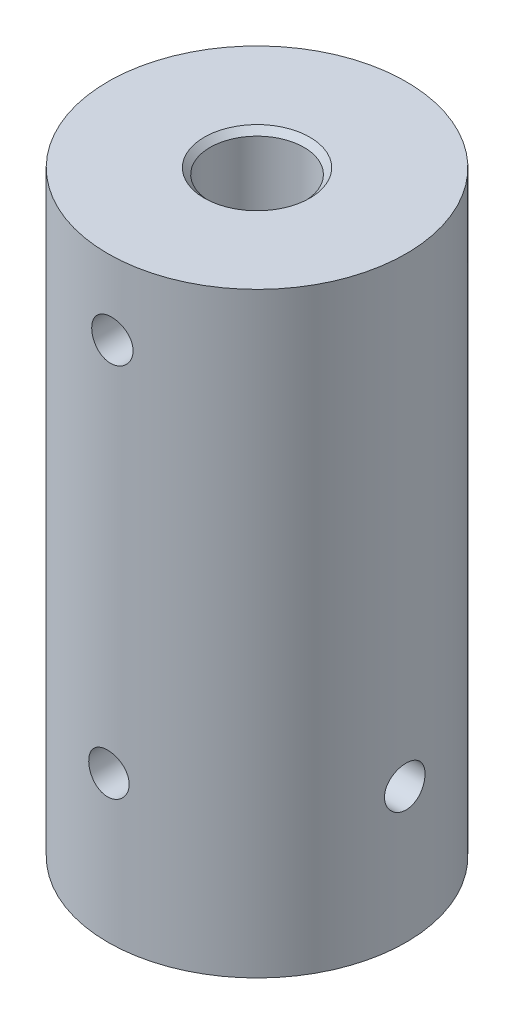
ISO-10303-21;
HEADER;
FILE_DESCRIPTION(('STEP AP214'),'2;1');
FILE_NAME('part.step','',(''),(''),'','','');
FILE_SCHEMA(('AUTOMOTIVE_DESIGN { 1 0 10303 214 1 1 1 1 }'));
ENDSEC;
DATA;
#1=APPLICATION_CONTEXT('core data for automotive mechanical design processes');
#2=APPLICATION_PROTOCOL_DEFINITION('international standard','automotive_design',2000,#1);
#3=PRODUCT_CONTEXT('',#1,'mechanical');
#4=PRODUCT('Part','Part','',(#3));
#5=PRODUCT_RELATED_PRODUCT_CATEGORY('part','',(#4));
#6=PRODUCT_DEFINITION_FORMATION('','',#4);
#7=PRODUCT_DEFINITION_CONTEXT('part definition',#1,'design');
#8=PRODUCT_DEFINITION('design','',#6,#7);
#9=PRODUCT_DEFINITION_SHAPE('','',#8);
#10=(LENGTH_UNIT() NAMED_UNIT(*) SI_UNIT(.MILLI.,.METRE.));
#11=(NAMED_UNIT(*) PLANE_ANGLE_UNIT() SI_UNIT($,.RADIAN.));
#12=(NAMED_UNIT(*) SI_UNIT($,.STERADIAN.) SOLID_ANGLE_UNIT());
#13=UNCERTAINTY_MEASURE_WITH_UNIT(LENGTH_MEASURE(1.E-05),#10,'distance_accuracy_value','');
#14=(GEOMETRIC_REPRESENTATION_CONTEXT(3) GLOBAL_UNCERTAINTY_ASSIGNED_CONTEXT((#13)) GLOBAL_UNIT_ASSIGNED_CONTEXT((#10,
#11,#12)) REPRESENTATION_CONTEXT('',''));
#15=CARTESIAN_POINT('',(0.,0.,0.));
#16=DIRECTION('',(0.,0.,1.));
#17=DIRECTION('',(1.,0.,0.));
#18=AXIS2_PLACEMENT_3D('',#15,#16,#17);
#19=CARTESIAN_POINT('',(0.,50.8,0.));
#20=DIRECTION('',(0.,-1.,0.));
#21=DIRECTION('',(0.,0.,-1.));
#22=AXIS2_PLACEMENT_3D('',#19,#20,#21);
#23=CYLINDRICAL_SURFACE('',#22,12.7);
#24=CARTESIAN_POINT('',(12.5820022317595,11.4993855714214,-1.72719999999999));
#25=CARTESIAN_POINT('',(12.5820037225729,11.4028505466484,-1.72719594160412));
#26=CARTESIAN_POINT('',(12.5831252320591,11.3062569789013,-1.71907949988969));
#27=CARTESIAN_POINT('',(12.5874878376331,11.1157632466158,-1.68683267865079));
#28=CARTESIAN_POINT('',(12.5907310869093,11.0218659194392,-1.66268603095068));
#29=CARTESIAN_POINT('',(12.598963186033,10.8395499911142,-1.59910832870822));
#30=CARTESIAN_POINT('',(12.6039507862348,10.7511275210359,-1.55968821383913));
#31=CARTESIAN_POINT('',(12.6151081153259,10.582167342932,-1.46670702209229));
#32=CARTESIAN_POINT('',(12.6212776585994,10.5016283998519,-1.41314816510401));
#33=CARTESIAN_POINT('',(12.6341493027854,10.3501749566901,-1.29303161470836));
#34=CARTESIAN_POINT('',(12.6408543311259,10.2793200466777,-1.226399089866));
#35=CARTESIAN_POINT('',(12.6540152202269,10.1497614311725,-1.08218800740543));
#36=CARTESIAN_POINT('',(12.6604710680442,10.0910583561977,-1.00460888215589));
#37=CARTESIAN_POINT('',(12.6724364709603,9.9872532583688,-0.840328960213507));
#38=CARTESIAN_POINT('',(12.6779422075282,9.94220559276877,-0.753593514488281));
#39=CARTESIAN_POINT('',(12.6873547535369,9.86733848378936,-0.573700755736347));
#40=CARTESIAN_POINT('',(12.6912616327857,9.83751837554277,-0.480543723291241));
#41=CARTESIAN_POINT('',(12.6970156301488,9.7941320827341,-0.291063702644292));
#42=CARTESIAN_POINT('',(12.6988753423787,9.78046647722212,-0.194763868004669));
#43=CARTESIAN_POINT('',(12.7003685417547,9.76946873947417,-0.00122111763925564));
#44=CARTESIAN_POINT('',(12.7000021316276,9.77213585354728,0.0960217543623074));
#45=CARTESIAN_POINT('',(12.6970945067381,9.79364867898443,0.288012998862792));
#46=CARTESIAN_POINT('',(12.6945676675802,9.81238745129156,0.382773602454356));
#47=CARTESIAN_POINT('',(12.6876391685609,9.86534421100894,0.567792612340058));
#48=CARTESIAN_POINT('',(12.6832374676367,9.89956253744988,0.658050919977567));
#49=CARTESIAN_POINT('',(12.6730290431331,9.982619012373,0.831831210644175));
#50=CARTESIAN_POINT('',(12.6672179338045,10.0315029114521,0.915331059548509));
#51=CARTESIAN_POINT('',(12.6548398050476,10.1424695685875,1.07298276747714));
#52=CARTESIAN_POINT('',(12.6482727446317,10.2045530424777,1.14713411917));
#53=CARTESIAN_POINT('',(12.6350538930607,10.3407541513179,1.2846131145532));
#54=CARTESIAN_POINT('',(12.6284018461964,10.4149650593878,1.34784836317975));
#55=CARTESIAN_POINT('',(12.6158149120429,10.5729955281679,1.46098062249143));
#56=CARTESIAN_POINT('',(12.609880027813,10.6568151298654,1.51087757627702));
#57=CARTESIAN_POINT('',(12.5993995529164,10.8317718088148,1.59592512612496));
#58=CARTESIAN_POINT('',(12.5948547422105,10.9229129580602,1.63106744756875));
#59=CARTESIAN_POINT('',(12.5876835878555,11.1098788430134,1.68552165441825));
#60=CARTESIAN_POINT('',(12.5850571340576,11.2057033094762,1.7048344487358));
#61=CARTESIAN_POINT('',(12.582040553515,11.3984971817657,1.72695720566815));
#62=CARTESIAN_POINT('',(12.581632753455,11.4954513553199,1.72989759176492));
#63=CARTESIAN_POINT('',(12.5830528391135,11.6884692196611,1.71953700651329));
#64=CARTESIAN_POINT('',(12.5848806681639,11.784532932957,1.70623644683549));
#65=CARTESIAN_POINT('',(12.5905498917523,11.9726466273042,1.66388167837241));
#66=CARTESIAN_POINT('',(12.5943831149082,12.0647112666843,1.63489138415517));
#67=CARTESIAN_POINT('',(12.6036245520476,12.2426735444716,1.56204615467546));
#68=CARTESIAN_POINT('',(12.6090328308836,12.3285709287618,1.51819060732691));
#69=CARTESIAN_POINT('',(12.6208570527191,12.4923481989019,1.41654216413006));
#70=CARTESIAN_POINT('',(12.6272790594339,12.5701748416406,1.35866419945537));
#71=CARTESIAN_POINT('',(12.6403884367481,12.7150564589663,1.23073328008148));
#72=CARTESIAN_POINT('',(12.6470758196018,12.7821109354047,1.16067976264717));
#73=CARTESIAN_POINT('',(12.6600171450505,12.9040072243102,1.00981460281669));
#74=CARTESIAN_POINT('',(12.6662678364784,12.9587630265102,0.928933146397997));
#75=CARTESIAN_POINT('',(12.6775821092696,13.0539108070506,0.759044913564677));
#76=CARTESIAN_POINT('',(12.6826457182413,13.0943031194592,0.670038326186057));
#77=CARTESIAN_POINT('',(12.6910009473217,13.1594372148108,0.486704954965122));
#78=CARTESIAN_POINT('',(12.6942980631558,13.1842275794125,0.392395691975403));
#79=CARTESIAN_POINT('',(12.6987717400676,13.2176117952425,0.200905217977011));
#80=CARTESIAN_POINT('',(12.6999484152677,13.2262065181232,0.103724161814702));
#81=CARTESIAN_POINT('',(12.7000478419233,13.2269371059654,-0.0899138519788295));
#82=CARTESIAN_POINT('',(12.6989886957704,13.2192051601187,-0.186370328008548));
#83=CARTESIAN_POINT('',(12.6947716743037,13.1877832722118,-0.376598825354471));
#84=CARTESIAN_POINT('',(12.6916138024572,13.1640933565158,-0.470370851105407));
#85=CARTESIAN_POINT('',(12.6835524800783,13.1014718161273,-0.652543272234527));
#86=CARTESIAN_POINT('',(12.6786498916813,13.0625477183173,-0.740946295443037));
#87=CARTESIAN_POINT('',(12.6676401595927,12.9705765218412,-0.90998696815259));
#88=CARTESIAN_POINT('',(12.6615329910489,12.9175291317853,-0.990624457389482));
#89=CARTESIAN_POINT('',(12.6487357043605,12.7983325236395,-1.14251854329586));
#90=CARTESIAN_POINT('',(12.642041445504,12.7320852124232,-1.21369781968888));
#91=CARTESIAN_POINT('',(12.628856609277,12.5885747841359,-1.34397915581267));
#92=CARTESIAN_POINT('',(12.6223660802974,12.5113090737207,-1.40307836432854));
#93=CARTESIAN_POINT('',(12.6102918616179,12.3475443946393,-1.5077588564507));
#94=CARTESIAN_POINT('',(12.6047124579219,12.2610047890056,-1.55327703872973));
#95=CARTESIAN_POINT('',(12.5951423742259,12.0814787134041,-1.62906745659383));
#96=CARTESIAN_POINT('',(12.5911500002129,11.9884992426223,-1.65935595770974));
#97=CARTESIAN_POINT('',(12.5861558970972,11.8291176725798,-1.69673254233386));
#98=CARTESIAN_POINT('',(12.5846062366623,11.763712695854,-1.70814097619139));
#99=CARTESIAN_POINT('',(12.5825288967843,11.6320095426961,-1.72337606261504));
#100=CARTESIAN_POINT('',(12.5820012074742,11.5657113748937,-1.72720278838035));
#101=CARTESIAN_POINT('',(12.5820022317595,11.4993855714214,-1.72719999999999));
#102=B_SPLINE_CURVE_WITH_KNOTS('',3,(#24,#25,#26,#27,#28,#29,#30,#31,#32,#33,#34,#35,#36,#37,
#38,#39,#40,#41,#42,#43,#44,#45,#46,#47,#48,#49,#50,#51,#52,#53,#54,#55,#56,#57,#58,#59,#60,#61,
#62,#63,#64,#65,#66,#67,#68,#69,#70,#71,#72,#73,#74,#75,#76,#77,#78,#79,#80,#81,#82,#83,#84,#85,
#86,#87,#88,#89,#90,#91,#92,#93,#94,#95,#96,#97,#98,#99,#100,#101),.UNSPECIFIED.,.T.,.F.,(4,2,2,
2,2,2,2,2,2,2,2,2,2,2,2,2,2,2,2,2,2,2,2,2,2,2,2,2,2,2,2,2,2,2,2,2,2,2,4),(0.,0.289362723314748,
0.579019554794704,0.868469300964614,1.15787362833577,1.44898550404674,1.74011248079234,
2.03238355459254,2.32464186613115,2.61509198640553,2.90552870364768,3.19404774796399,
3.4825731116836,3.77200808523206,4.06145875930514,4.35325056454028,4.64504361450403,
4.93700008849692,5.22893979753616,5.51855053558863,5.80815393282759,6.09658636939458,
6.3850306837901,6.6752707419998,6.96552421822252,7.25774840036897,7.54996578547769,
7.84126869677946,8.13255592965865,8.42149379643416,8.71043118585449,8.99922599736082,
9.28802676770285,9.57905963247294,9.87016110956462,10.1625947866687,10.4547154732226,
10.6535282923201,10.8523391919281),.UNSPECIFIED.);
#103=CARTESIAN_POINT('',(12.5820022317595,11.4993855714214,-1.72719999999999));
#104=VERTEX_POINT('',#103);
#105=EDGE_CURVE('E119',#104,#104,#102,.T.);
#106=ORIENTED_EDGE('',*,*,#105,.T.);
#107=EDGE_LOOP('',(#106));
#108=FACE_BOUND('',#107,.T.);
#109=CARTESIAN_POINT('',(1.69242104120704,12.4445177969826,12.5867275738883));
#110=CARTESIAN_POINT('',(1.69241697870657,12.3479827722096,12.58672905348));
#111=CARTESIAN_POINT('',(1.68429746851841,12.2513892044625,12.5878281276067));
#112=CARTESIAN_POINT('',(1.65203871367347,12.0608954721771,12.5921015973049));
#113=CARTESIAN_POINT('',(1.62788319495249,11.9669981450005,12.595278101097));
#114=CARTESIAN_POINT('',(1.5642829847935,11.7846822166754,12.6033344616988));
#115=CARTESIAN_POINT('',(1.52484923644058,11.6962597465971,12.6082130991011));
#116=CARTESIAN_POINT('',(1.43183756472865,11.5272995684932,12.6191134172828));
#117=CARTESIAN_POINT('',(1.37826186176364,11.4467606254131,12.6251349185823));
#118=CARTESIAN_POINT('',(1.25811019724826,11.2953071822513,12.637674552436));
#119=CARTESIAN_POINT('',(1.19145939645827,11.2244522722389,12.6441954055985));
#120=CARTESIAN_POINT('',(1.0472124925186,11.0948936567338,12.6569576941941));
#121=CARTESIAN_POINT('',(0.969615821775514,11.0361905817589,12.6631991151152));
#122=CARTESIAN_POINT('',(0.805303458911231,10.93238548393,12.6747104586638));
#123=CARTESIAN_POINT('',(0.718553128443087,10.88733781833,12.6799764670171));
#124=CARTESIAN_POINT('',(0.538635043619093,10.8124707093506,12.6888918148518));
#125=CARTESIAN_POINT('',(0.445467569650846,10.782650601104,12.6925412249164));
#126=CARTESIAN_POINT('',(0.255972370525371,10.7392643082953,12.6977715421552));
#127=CARTESIAN_POINT('',(0.159667764036098,10.7255987027833,12.6993651073856));
#128=CARTESIAN_POINT('',(-0.0338783739002463,10.7146009650354,12.7003234149097));
#129=CARTESIAN_POINT('',(-0.13111986190716,10.7172680791085,12.6996882600508));
#130=CARTESIAN_POINT('',(-0.323102337526381,10.7387809045456,12.6962500479487));
#131=CARTESIAN_POINT('',(-0.417855595913888,10.7575196768528,12.6934613324527));
#132=CARTESIAN_POINT('',(-0.602854751220004,10.8104764365701,12.6860215304547));
#133=CARTESIAN_POINT('',(-0.693100549368877,10.8446947630111,12.6813704031627));
#134=CARTESIAN_POINT('',(-0.866851963780246,10.9277512379342,12.6706817481928));
#135=CARTESIAN_POINT('',(-0.950335433881792,10.9766351370133,12.6646398959536));
#136=CARTESIAN_POINT('',(-1.10795233082631,11.0876017941487,12.651826118918));
#137=CARTESIAN_POINT('',(-1.1820852502265,11.1496852680389,12.6450541545363));
#138=CARTESIAN_POINT('',(-1.3195271881923,11.2858863768791,12.6314554083942));
#139=CARTESIAN_POINT('',(-1.38274381134028,11.360097284949,12.6246286262742));
#140=CARTESIAN_POINT('',(-1.49584085261683,11.5181277537291,12.6117290812109));
#141=CARTESIAN_POINT('',(-1.54572121385453,11.6019473554266,12.6056563214842));
#142=CARTESIAN_POINT('',(-1.63073947445533,11.776904034376,12.5949408441914));
#143=CARTESIAN_POINT('',(-1.66586910138699,11.8680451836214,12.5902989294514));
#144=CARTESIAN_POINT('',(-1.72030328165589,12.0550110685747,12.5829773096276));
#145=CARTESIAN_POINT('',(-1.73960874359709,12.1508355350374,12.5802974918836));
#146=CARTESIAN_POINT('',(-1.76172307924483,12.3436294073269,12.5772197831064));
#147=CARTESIAN_POINT('',(-1.76466232709224,12.4405835808811,12.5768038583794));
#148=CARTESIAN_POINT('',(-1.75430570603918,12.6336014452223,12.5782525717386));
#149=CARTESIAN_POINT('',(-1.74101024865113,12.7296651585182,12.5801171520191));
#150=CARTESIAN_POINT('',(-1.69867130973758,12.9177788528654,12.5859034080912));
#151=CARTESIAN_POINT('',(-1.66969171995313,13.0098434922455,12.5898167358937));
#152=CARTESIAN_POINT('',(-1.59687230884321,13.1878057700328,12.5992594571095));
#153=CARTESIAN_POINT('',(-1.55303187561325,13.273703154323,12.6047889170666));
#154=CARTESIAN_POINT('',(-1.45141649871913,13.4374804244631,12.6168940153737));
#155=CARTESIAN_POINT('',(-1.39355650331151,13.5153070672018,12.6234759525171));
#156=CARTESIAN_POINT('',(-1.26566230234224,13.6601886845275,12.636938837195));
#157=CARTESIAN_POINT('',(-1.1956275340815,13.7272431609659,12.6438197985388));
#158=CARTESIAN_POINT('',(-1.04479871580146,13.8491394498714,12.6571780144112));
#159=CARTESIAN_POINT('',(-0.963934843041143,13.9038952520714,12.6636522107272));
#160=CARTESIAN_POINT('',(-0.794078527787123,13.9990430326118,12.6754359534412));
#161=CARTESIAN_POINT('',(-0.705086274405012,14.0394353450204,12.680745526925));
#162=CARTESIAN_POINT('',(-0.521776694321624,14.104569440372,12.6896073950052));
#163=CARTESIAN_POINT('',(-0.427476903594342,14.1293598049737,12.6931651368843));
#164=CARTESIAN_POINT('',(-0.235999524598465,14.1627440208038,12.6981680110691));
#165=CARTESIAN_POINT('',(-0.138822091491037,14.1713387436844,12.6996132570688));
#166=CARTESIAN_POINT('',(0.0548149080344759,14.1720693315266,12.7002478327699));
#167=CARTESIAN_POINT('',(0.151273942824061,14.1643373856799,12.6994552634626));
#168=CARTESIAN_POINT('',(0.341513368112989,14.132915497773,12.6957639847849));
#169=CARTESIAN_POINT('',(0.435293763037466,14.109225582077,12.692865278894));
#170=CARTESIAN_POINT('',(0.617487767211571,14.0466040416885,12.6853074497382));
#171=CARTESIAN_POINT('',(0.705904001898842,14.0076799438785,12.6806491958679));
#172=CARTESIAN_POINT('',(0.874974456201189,13.9157087474024,12.6701066765883));
#173=CARTESIAN_POINT('',(0.95562851562141,13.8626613573465,12.6642223858841));
#174=CARTESIAN_POINT('',(1.10755738879313,13.7434647492007,12.6518449315137));
#175=CARTESIAN_POINT('',(1.17875489400694,13.6772174379844,12.6453474134645));
#176=CARTESIAN_POINT('',(1.30907217098802,13.5337070096971,12.6325226807666));
#177=CARTESIAN_POINT('',(1.36818909141751,13.4564412992819,12.6261955066289));
#178=CARTESIAN_POINT('',(1.47290255279624,13.2926766202005,12.6144106352361));
#179=CARTESIAN_POINT('',(1.51843598081414,13.2061370145668,12.6089570495781));
#180=CARTESIAN_POINT('',(1.59425255768848,13.0266109389653,12.5995964612942));
#181=CARTESIAN_POINT('',(1.62455197669532,12.9336314681836,12.5956878096142));
#182=CARTESIAN_POINT('',(1.66194222057918,12.774249898141,12.5907970217022));
#183=CARTESIAN_POINT('',(1.67335489360179,12.7088449214152,12.5892788962054));
#184=CARTESIAN_POINT('',(1.68859566290287,12.5771417682573,12.5872436688431));
#185=CARTESIAN_POINT('',(1.69242383240752,12.5108436004549,12.5867265573131));
#186=CARTESIAN_POINT('',(1.69242104120704,12.4445177969826,12.5867275738883));
#187=B_SPLINE_CURVE_WITH_KNOTS('',3,(#109,#110,#111,#112,#113,#114,#115,#116,#117,#118,#119,
#120,#121,#122,#123,#124,#125,#126,#127,#128,#129,#130,#131,#132,#133,#134,#135,#136,#137,#138,
#139,#140,#141,#142,#143,#144,#145,#146,#147,#148,#149,#150,#151,#152,#153,#154,#155,#156,#157,
#158,#159,#160,#161,#162,#163,#164,#165,#166,#167,#168,#169,#170,#171,#172,#173,#174,#175,#176,
#177,#178,#179,#180,#181,#182,#183,#184,#185,#186),.UNSPECIFIED.,.T.,.F.,(4,2,2,2,2,2,2,2,2,2,2,
2,2,2,2,2,2,2,2,2,2,2,2,2,2,2,2,2,2,2,2,2,2,2,2,2,2,2,4),(0.,0.289362723314748,
0.579019554794704,0.868469300964612,1.15787362833577,1.44898550404674,1.74011248079234,
2.03238355459254,2.32464186613115,2.61509198640553,2.90552870364768,3.19404774796398,
3.4825731116836,3.77200808523206,4.06145875930514,4.35325056454028,4.64504361450403,
4.93700008849692,5.22893979753616,5.51855053558862,5.80815393282759,6.09658636939458,
6.3850306837901,6.6752707419998,6.96552421822252,7.25774840036897,7.54996578547769,
7.84126869677946,8.13255592965865,8.42149379643416,8.71043118585449,8.99922599736082,
9.28802676770285,9.57905963247294,9.87016110956462,10.1625947866687,10.4547154732226,
10.6535282923201,10.8523391919281),.UNSPECIFIED.);
#188=CARTESIAN_POINT('',(1.69242104120704,12.4445177969826,12.5867275738883));
#189=VERTEX_POINT('',#188);
#190=EDGE_CURVE('E118',#189,#189,#187,.T.);
#191=ORIENTED_EDGE('',*,*,#190,.T.);
#192=EDGE_LOOP('',(#191));
#193=FACE_BOUND('',#192,.T.);
#194=CARTESIAN_POINT('',(1.98331770959402,44.551690017214,12.5441799597587));
#195=CARTESIAN_POINT('',(1.98331368243076,44.455154992441,12.5441815329903));
#196=CARTESIAN_POINT('',(1.97522178847947,44.3585614246939,12.5454682582572));
#197=CARTESIAN_POINT('',(1.94307059670477,44.1680676924084,12.5504872895257));
#198=CARTESIAN_POINT('',(1.91899507797743,44.0741703652318,12.5542220798854));
#199=CARTESIAN_POINT('',(1.85559839255229,43.8918544369068,12.5637484619646));
#200=CARTESIAN_POINT('',(1.81628813778138,43.8034319668285,12.5695385812994));
#201=CARTESIAN_POINT('',(1.72355370147619,43.6344717887246,12.5825889580858));
#202=CARTESIAN_POINT('',(1.67013173558647,43.5539328456445,12.5898489847093));
#203=CARTESIAN_POINT('',(1.55030252420091,43.4024794024827,12.6051664584473));
#204=CARTESIAN_POINT('',(1.48382052249268,43.3316244924703,12.6132283577757));
#205=CARTESIAN_POINT('',(1.33990768157337,43.2020658769651,12.6293261689596));
#206=CARTESIAN_POINT('',(1.26247627458505,43.1433628019903,12.6373620794452));
#207=CARTESIAN_POINT('',(1.09847439488673,43.0395577041614,12.652673744141));
#208=CARTESIAN_POINT('',(1.01186920250537,42.9945100385614,12.6599463869135));
#209=CARTESIAN_POINT('',(0.832205691625753,42.919642929582,12.6730239834877));
#210=CARTESIAN_POINT('',(0.739147655073791,42.8898228213354,12.6788290013634));
#211=CARTESIAN_POINT('',(0.549824297047245,42.8464365285267,12.6884442400798));
#212=CARTESIAN_POINT('',(0.453582381047473,42.8327709230147,12.692266580448));
#213=CARTESIAN_POINT('',(0.26011028365109,42.8217731852668,12.6977047228175));
#214=CARTESIAN_POINT('',(0.162880148063645,42.8244402993399,12.6993206266329));
#215=CARTESIAN_POINT('',(-0.029130474016746,42.845953124777,12.700327232636));
#216=CARTESIAN_POINT('',(-0.123922896022809,42.8646918970841,12.6997325567647));
#217=CARTESIAN_POINT('',(-0.309044695319047,42.9176486568015,12.6965769992752));
#218=CARTESIAN_POINT('',(-0.399373974810131,42.9518669832425,12.6940160745917));
#219=CARTESIAN_POINT('',(-0.573326249427902,43.0349234581656,12.6873521785601));
#220=CARTESIAN_POINT('',(-0.656927204429808,43.0838073572447,12.6832443711833));
#221=CARTESIAN_POINT('',(-0.814798475687208,43.1947740143801,12.6740824502106));
#222=CARTESIAN_POINT('',(-0.889068285552192,43.2568574882703,12.6690282852941));
#223=CARTESIAN_POINT('',(-1.02678817345317,43.3930585971105,12.6586146075108));
#224=CARTESIAN_POINT('',(-1.09014588083602,43.4672695051804,12.6532529555699));
#225=CARTESIAN_POINT('',(-1.20351121025705,43.6252999739605,12.6429747702431));
#226=CARTESIAN_POINT('',(-1.25351877534514,43.709119575658,12.6380582387561));
#227=CARTESIAN_POINT('',(-1.33876229192942,43.8840762546074,12.6293135849869));
#228=CARTESIAN_POINT('',(-1.37398995462732,43.9752174038528,12.6254860738304));
#229=CARTESIAN_POINT('',(-1.42857902648467,44.162183288806,12.6194264259739));
#230=CARTESIAN_POINT('',(-1.44794134661242,44.2580077552688,12.6171941976757));
#231=CARTESIAN_POINT('',(-1.47012099799151,44.4508016275583,12.6146292031026));
#232=CARTESIAN_POINT('',(-1.47306908588495,44.5477558011125,12.6142814257894));
#233=CARTESIAN_POINT('',(-1.46268170579497,44.7407736654537,12.6154900220413));
#234=CARTESIAN_POINT('',(-1.44934665055176,44.8368373787496,12.6170463473417));
#235=CARTESIAN_POINT('',(-1.40688511897777,45.0249510730968,12.6218510163258));
#236=CARTESIAN_POINT('',(-1.37782271050337,45.1170157124769,12.6250924931856));
#237=CARTESIAN_POINT('',(-1.30480423589025,45.2949779902642,12.6328471036547));
#238=CARTESIAN_POINT('',(-1.26084755647067,45.3808753745543,12.6373602896261));
#239=CARTESIAN_POINT('',(-1.15897920445143,45.5446526446945,12.6471100118397));
#240=CARTESIAN_POINT('',(-1.10098235709608,45.6224792874332,12.6523508764602));
#241=CARTESIAN_POINT('',(-0.972810792838918,45.7673609047589,12.6628497345547));
#242=CARTESIAN_POINT('',(-0.902635513069128,45.8344153811973,12.6681077288094));
#243=CARTESIAN_POINT('',(-0.751537899349227,45.9563116701028,12.6779710691765));
#244=CARTESIAN_POINT('',(-0.670545832155892,46.0110674723028,12.6825717416801));
#245=CARTESIAN_POINT('',(-0.500462264609754,46.1062152528432,12.6904205934943));
#246=CARTESIAN_POINT('',(-0.411370952690903,46.1466075652518,12.6936688042608));
#247=CARTESIAN_POINT('',(-0.227905358772192,46.2117416606034,12.6982851560969));
#248=CARTESIAN_POINT('',(-0.133548481957309,46.2365320252051,12.6996591489019));
#249=CARTESIAN_POINT('',(0.0579933967070409,46.2699162410351,12.7002284774286));
#250=CARTESIAN_POINT('',(0.155178246068636,46.2785109639158,12.6994239304053));
#251=CARTESIAN_POINT('',(0.348778051828461,46.279241551758,12.6955761412581));
#252=CARTESIAN_POINT('',(0.445192895731687,46.2715096059113,12.6925510075814));
#253=CARTESIAN_POINT('',(0.635295905270845,46.2400877180044,12.684457168153));
#254=CARTESIAN_POINT('',(0.728984075411267,46.2163978023084,12.6793884657774));
#255=CARTESIAN_POINT('',(0.910954318877679,46.1537762619199,12.6676153425164));
#256=CARTESIAN_POINT('',(0.999239037062089,46.1148521641099,12.6609117300206));
#257=CARTESIAN_POINT('',(1.16802015910053,46.0228809676338,12.6464584925214));
#258=CARTESIAN_POINT('',(1.24851640221711,45.9698335775779,12.638708845938));
#259=CARTESIAN_POINT('',(1.4001180619986,45.8506369694321,12.6228179481843));
#260=CARTESIAN_POINT('',(1.47114609004697,45.7843896582158,12.6146741332901));
#261=CARTESIAN_POINT('',(1.60113159085328,45.6408792299285,12.5988363295072));
#262=CARTESIAN_POINT('',(1.66008621397517,45.5636135195133,12.5911424471196));
#263=CARTESIAN_POINT('',(1.76449882948785,45.3998488404319,12.5769368880156));
#264=CARTESIAN_POINT('',(1.80989382103043,45.3133092347982,12.5704307826953));
#265=CARTESIAN_POINT('',(1.88547341046068,45.1337831591967,12.5593177451484));
#266=CARTESIAN_POINT('',(1.91567423596805,45.0408036884149,12.5547087876978));
#267=CARTESIAN_POINT('',(1.95294125254787,44.8814221183724,12.5489538229426));
#268=CARTESIAN_POINT('',(1.96431572701945,44.8160171416466,12.547171930398));
#269=CARTESIAN_POINT('',(1.97950530251187,44.6843139884887,12.5447844640286));
#270=CARTESIAN_POINT('',(1.98332047651556,44.6180158206863,12.5441788788468));
#271=CARTESIAN_POINT('',(1.98331770959402,44.551690017214,12.5441799597587));
#272=B_SPLINE_CURVE_WITH_KNOTS('',3,(#194,#195,#196,#197,#198,#199,#200,#201,#202,#203,#204,
#205,#206,#207,#208,#209,#210,#211,#212,#213,#214,#215,#216,#217,#218,#219,#220,#221,#222,#223,
#224,#225,#226,#227,#228,#229,#230,#231,#232,#233,#234,#235,#236,#237,#238,#239,#240,#241,#242,
#243,#244,#245,#246,#247,#248,#249,#250,#251,#252,#253,#254,#255,#256,#257,#258,#259,#260,#261,
#262,#263,#264,#265,#266,#267,#268,#269,#270,#271),.UNSPECIFIED.,.T.,.F.,(4,2,2,2,2,2,2,2,2,2,2,
2,2,2,2,2,2,2,2,2,2,2,2,2,2,2,2,2,2,2,2,2,2,2,2,2,2,2,4),(0.,0.289362723314744,
0.579019554794704,0.86846930096462,1.15787362833578,1.44898550404674,1.74011248079235,
2.03238355459254,2.32464186613115,2.61509198640554,2.90552870364769,3.19404774796399,
3.4825731116836,3.77200808523207,4.06145875930514,4.35325056454028,4.64504361450404,
4.93700008849693,5.22893979753618,5.51855053558864,5.8081539328276,6.09658636939459,
6.38503068379012,6.67527074199982,6.96552421822255,7.25774840036899,7.54996578547771,
7.84126869677948,8.13255592965867,8.42149379643418,8.71043118585451,8.99922599736085,
9.28802676770287,9.57905963247297,9.87016110956465,10.1625947866688,10.4547154732227,
10.6535282923201,10.8523391919282),.UNSPECIFIED.);
#273=CARTESIAN_POINT('',(1.98331770959402,44.551690017214,12.5441799597587));
#274=VERTEX_POINT('',#273);
#275=EDGE_CURVE('E73',#274,#274,#272,.T.);
#276=ORIENTED_EDGE('',*,*,#275,.T.);
#277=EDGE_LOOP('',(#276));
#278=FACE_BOUND('',#277,.T.);
#279=CARTESIAN_POINT('',(0.,50.8,0.));
#280=DIRECTION('',(0.,1.,0.));
#281=DIRECTION('',(0.,0.,1.));
#282=AXIS2_PLACEMENT_3D('',#279,#280,#281);
#283=CIRCLE('',#282,12.7);
#284=CARTESIAN_POINT('',(0.,50.8,12.7));
#285=VERTEX_POINT('',#284);
#286=EDGE_CURVE('E11',#285,#285,#283,.T.);
#287=ORIENTED_EDGE('',*,*,#286,.F.);
#288=EDGE_LOOP('',(#287));
#289=FACE_BOUND('',#288,.T.);
#290=CARTESIAN_POINT('',(0.,0.,0.));
#291=DIRECTION('',(0.,1.,0.));
#292=DIRECTION('',(0.,0.,1.));
#293=AXIS2_PLACEMENT_3D('',#290,#291,#292);
#294=CIRCLE('',#293,12.7);
#295=CARTESIAN_POINT('',(0.,0.,12.7));
#296=VERTEX_POINT('',#295);
#297=EDGE_CURVE('E45',#296,#296,#294,.T.);
#298=ORIENTED_EDGE('',*,*,#297,.T.);
#299=EDGE_LOOP('',(#298));
#300=FACE_BOUND('',#299,.T.);
#301=ADVANCED_FACE('F41',(#108,#193,#278,#289,#300),#23,.T.);
#302=CARTESIAN_POINT('',(0.,50.8,0.));
#303=DIRECTION('',(0.,1.,0.));
#304=DIRECTION('',(0.,0.,1.));
#305=AXIS2_PLACEMENT_3D('',#302,#303,#304);
#306=PLANE('',#305);
#307=CARTESIAN_POINT('',(0.,50.8,0.));
#308=DIRECTION('',(0.,1.,0.));
#309=DIRECTION('',(0.,0.,1.));
#310=AXIS2_PLACEMENT_3D('',#307,#308,#309);
#311=CIRCLE('',#310,4.5);
#312=CARTESIAN_POINT('',(0.,50.8,4.5));
#313=VERTEX_POINT('',#312);
#314=EDGE_CURVE('E153',#313,#313,#311,.T.);
#315=ORIENTED_EDGE('',*,*,#314,.F.);
#316=EDGE_LOOP('',(#315));
#317=FACE_BOUND('',#316,.T.);
#318=ORIENTED_EDGE('',*,*,#286,.T.);
#319=EDGE_LOOP('',(#318));
#320=FACE_BOUND('',#319,.T.);
#321=ADVANCED_FACE('F139',(#317,#320),#306,.T.);
#322=CARTESIAN_POINT('',(0.,0.,0.));
#323=DIRECTION('',(0.,1.,0.));
#324=DIRECTION('',(0.,0.,1.));
#325=AXIS2_PLACEMENT_3D('',#322,#323,#324);
#326=PLANE('',#325);
#327=CARTESIAN_POINT('',(0.,0.,0.));
#328=DIRECTION('',(0.,-1.,0.));
#329=DIRECTION('',(0.,0.,-1.));
#330=AXIS2_PLACEMENT_3D('',#327,#328,#329);
#331=CIRCLE('',#330,10.16);
#332=CARTESIAN_POINT('',(0.,0.,-10.16));
#333=VERTEX_POINT('',#332);
#334=EDGE_CURVE('E76',#333,#333,#331,.T.);
#335=ORIENTED_EDGE('',*,*,#334,.F.);
#336=EDGE_LOOP('',(#335));
#337=FACE_BOUND('',#336,.T.);
#338=ORIENTED_EDGE('',*,*,#297,.F.);
#339=EDGE_LOOP('',(#338));
#340=FACE_BOUND('',#339,.T.);
#341=ADVANCED_FACE('F135',(#337,#340),#326,.F.);
#342=CARTESIAN_POINT('',(0.,34.29,0.));
#343=DIRECTION('',(0.,1.,0.));
#344=DIRECTION('',(0.,0.,1.));
#345=AXIS2_PLACEMENT_3D('',#342,#343,#344);
#346=CONICAL_SURFACE('',#345,3.99999999999999,1.02974425867665);
#347=CARTESIAN_POINT('',(0.,31.8865575238898,0.));
#348=VERTEX_POINT('',#347);
#349=VERTEX_LOOP('',#348);
#350=FACE_BOUND('',#349,.T.);
#351=CARTESIAN_POINT('',(0.,34.29,0.));
#352=DIRECTION('',(0.,1.,0.));
#353=DIRECTION('',(0.,0.,1.));
#354=AXIS2_PLACEMENT_3D('',#351,#352,#353);
#355=CIRCLE('',#354,3.99999999999999);
#356=CARTESIAN_POINT('',(0.,34.29,3.99999999999999));
#357=VERTEX_POINT('',#356);
#358=EDGE_CURVE('E144',#357,#357,#355,.T.);
#359=ORIENTED_EDGE('',*,*,#358,.T.);
#360=EDGE_LOOP('',(#359));
#361=FACE_BOUND('',#360,.T.);
#362=ADVANCED_FACE('F138',(#350,#361),#346,.F.);
#363=CARTESIAN_POINT('',(0.,50.8,0.));
#364=DIRECTION('',(0.,1.,0.));
#365=DIRECTION('',(0.,0.,1.));
#366=AXIS2_PLACEMENT_3D('',#363,#364,#365);
#367=CYLINDRICAL_SURFACE('',#366,3.99999999999999);
#368=CARTESIAN_POINT('',(0.,42.8264157032606,3.99999999999999));
#369=CARTESIAN_POINT('',(0.091394612864093,42.8221012778358,3.99999673773102));
#370=CARTESIAN_POINT('',(0.183278826839766,42.8250699901992,3.99683284346785));
#371=CARTESIAN_POINT('',(0.365122232591143,42.8454984270114,3.98434854968537));
#372=CARTESIAN_POINT('',(0.455076423272296,42.8629920037279,3.97501377842617));
#373=CARTESIAN_POINT('',(0.630132648978754,42.9116971685853,3.95103954870938));
#374=CARTESIAN_POINT('',(0.715248793041961,42.9428662822294,3.93641653937595));
#375=CARTESIAN_POINT('',(0.878827891278565,43.017792926356,3.9031573979959));
#376=CARTESIAN_POINT('',(0.957292430886447,43.0615474460756,3.88452222603276));
#377=CARTESIAN_POINT('',(1.10923944109054,43.16254696747,3.84396128142456));
#378=CARTESIAN_POINT('',(1.18235869014655,43.2202943895989,3.82192790980275));
#379=CARTESIAN_POINT('',(1.3182398211123,43.3467429886983,3.77721724580498));
#380=CARTESIAN_POINT('',(1.38099577854846,43.4154503874372,3.75453959372959));
#381=CARTESIAN_POINT('',(1.49848034568953,43.5671171525403,3.70928201367303));
#382=CARTESIAN_POINT('',(1.55243677936765,43.6507076867127,3.68680148510738));
#383=CARTESIAN_POINT('',(1.64553496713568,43.8267504828827,3.64620449471931));
#384=CARTESIAN_POINT('',(1.68468146586846,43.9191998948552,3.62808663591044));
#385=CARTESIAN_POINT('',(1.74561781270477,44.1073155653644,3.59915677777945));
#386=CARTESIAN_POINT('',(1.76794008149092,44.2027735484755,3.58812247176094));
#387=CARTESIAN_POINT('',(1.79623591062242,44.3966315618646,3.57404545940628));
#388=CARTESIAN_POINT('',(1.80222216482267,44.4950292477105,3.57099654811547));
#389=CARTESIAN_POINT('',(1.79777201731265,44.6824864829981,3.57323500621566));
#390=CARTESIAN_POINT('',(1.78875900292409,44.7715927900871,3.57779993420596));
#391=CARTESIAN_POINT('',(1.75736202055492,44.9468351739944,3.59332450241225));
#392=CARTESIAN_POINT('',(1.73497599215696,45.0329707909467,3.60428512802508));
#393=CARTESIAN_POINT('',(1.67763959617745,45.200226804845,3.63132506153395));
#394=CARTESIAN_POINT('',(1.6426680527833,45.281338477501,3.64741299114638));
#395=CARTESIAN_POINT('',(1.56121405270235,45.4367383413259,3.68301260705529));
#396=CARTESIAN_POINT('',(1.5147273718796,45.5110240147507,3.70252554899322));
#397=CARTESIAN_POINT('',(1.40666955679399,45.6577150091985,3.74498836190044));
#398=CARTESIAN_POINT('',(1.34412118460263,45.7293580025249,3.76808953811104));
#399=CARTESIAN_POINT('',(1.20797634192408,45.8614323176994,3.81391535601336));
#400=CARTESIAN_POINT('',(1.13437572929236,45.9218594170023,3.83663985297307));
#401=CARTESIAN_POINT('',(0.974210202547409,46.0323316057769,3.88047599158487));
#402=CARTESIAN_POINT('',(0.887219886407431,46.0818090020111,3.90147407577696));
#403=CARTESIAN_POINT('',(0.705061442909024,46.1651136328356,3.93846471164851));
#404=CARTESIAN_POINT('',(0.609897467384333,46.1989487578648,3.95445978567903));
#405=CARTESIAN_POINT('',(0.419848621962793,46.2480539509343,3.97899183708509));
#406=CARTESIAN_POINT('',(0.325258211685232,46.2642739380604,3.98790258667348));
#407=CARTESIAN_POINT('',(0.134319628459383,46.280742692034,3.9988857678978));
#408=CARTESIAN_POINT('',(0.0379722053049024,46.2809981191748,4.00096105089631));
#409=CARTESIAN_POINT('',(-0.147169742554225,46.2660433456547,3.99829587189081));
#410=CARTESIAN_POINT('',(-0.23605294060653,46.2518221349314,3.99398321736631));
#411=CARTESIAN_POINT('',(-0.410142066565522,46.2099861626094,3.97987607496984));
#412=CARTESIAN_POINT('',(-0.495347702499564,46.1823703396947,3.97008115270341));
#413=CARTESIAN_POINT('',(-0.661417615681395,46.1141362714191,3.94584559896958));
#414=CARTESIAN_POINT('',(-0.742180313173578,46.0732997441656,3.93132695441777));
#415=CARTESIAN_POINT('',(-0.895995891612183,45.9800011994285,3.89915059994028));
#416=CARTESIAN_POINT('',(-0.969045907384481,45.927534883887,3.88149172994985));
#417=CARTESIAN_POINT('',(-1.11118096828065,45.807876851307,3.84331796488074));
#418=CARTESIAN_POINT('',(-1.17955311149259,45.7398737366875,3.82268813666472));
#419=CARTESIAN_POINT('',(-1.30422491835018,45.5933866877421,3.78197140281574));
#420=CARTESIAN_POINT('',(-1.36051939651873,45.5148982749866,3.76188473360679));
#421=CARTESIAN_POINT('',(-1.46126180593735,45.3461705562276,3.72393886058184));
#422=CARTESIAN_POINT('',(-1.50522217226225,45.2556145482703,3.70618313956227));
#423=CARTESIAN_POINT('',(-1.57685317112504,45.0674207231324,3.67628335519761));
#424=CARTESIAN_POINT('',(-1.60453683599829,44.9697886421354,3.66413480401643));
#425=CARTESIAN_POINT('',(-1.64094393849586,44.7775238525306,3.64796859467315));
#426=CARTESIAN_POINT('',(-1.65086075147054,44.6831608665099,3.64344053060982));
#427=CARTESIAN_POINT('',(-1.6549362220356,44.4940402538615,3.64159250750472));
#428=CARTESIAN_POINT('',(-1.64910058166653,44.3992827824267,3.64426994023105));
#429=CARTESIAN_POINT('',(-1.62293664732371,44.2189521790982,3.655988657203));
#430=CARTESIAN_POINT('',(-1.60363613407256,44.133196469151,3.66457808661435));
#431=CARTESIAN_POINT('',(-1.55244944401025,43.9661838781886,3.68655269894684));
#432=CARTESIAN_POINT('',(-1.52055999255617,43.8849281739938,3.69993912958345));
#433=CARTESIAN_POINT('',(-1.44347798453396,43.7250170083012,3.73070564218651));
#434=CARTESIAN_POINT('',(-1.39773673368398,43.6466572235655,3.74824223224434));
#435=CARTESIAN_POINT('',(-1.2948440363808,43.498269152186,3.78501793812197));
#436=CARTESIAN_POINT('',(-1.23768837956732,43.4282439551259,3.80425768071067));
#437=CARTESIAN_POINT('',(-1.10771934551705,43.2921146985156,3.84421236112468));
#438=CARTESIAN_POINT('',(-1.03397247275854,43.2268928599737,3.86490872406671));
#439=CARTESIAN_POINT('',(-0.876048578426148,43.1094807954899,3.90373463129615));
#440=CARTESIAN_POINT('',(-0.791865253575254,43.0572985029419,3.92186261006234));
#441=CARTESIAN_POINT('',(-0.614811189301361,42.9675030341666,3.95349525472623));
#442=CARTESIAN_POINT('',(-0.521907914941563,42.9299473489562,3.96698165286484));
#443=CARTESIAN_POINT('',(-0.330530567170587,42.8713339994841,3.9874730112926));
#444=CARTESIAN_POINT('',(-0.232074813289451,42.8502251363438,3.99449809803714));
#445=CARTESIAN_POINT('',(-0.110581770167023,42.8350579846835,3.99853275256548));
#446=CARTESIAN_POINT('',(-0.0885192134642361,42.8327354308385,3.99908155210332));
#447=CARTESIAN_POINT('',(-0.0443140445553198,42.8289375894613,3.99981557972411));
#448=CARTESIAN_POINT('',(-0.0221714287804061,42.8274623401797,4.00000079139417));
#449=CARTESIAN_POINT('',(0.,42.8264157032606,3.99999999999999));
#450=B_SPLINE_CURVE_WITH_KNOTS('',3,(#368,#369,#370,#371,#372,#373,#374,#375,#376,#377,#378,
#379,#380,#381,#382,#383,#384,#385,#386,#387,#388,#389,#390,#391,#392,#393,#394,#395,#396,#397,
#398,#399,#400,#401,#402,#403,#404,#405,#406,#407,#408,#409,#410,#411,#412,#413,#414,#415,#416,
#417,#418,#419,#420,#421,#422,#423,#424,#425,#426,#427,#428,#429,#430,#431,#432,#433,#434,#435,
#436,#437,#438,#439,#440,#441,#442,#443,#444,#445,#446,#447,#448,#449),.UNSPECIFIED.,.T.,.F.,(4,
2,2,2,2,2,2,2,2,2,2,2,2,2,2,2,2,2,2,2,2,2,2,2,2,2,2,2,2,2,2,2,2,2,2,2,2,2,2,2,4),(0.,
0.274398575779547,0.54943847763446,0.823630121281331,1.09775622549484,1.38376096269993,
1.66992864091479,1.97443558504092,2.27884489182862,2.57316165493969,2.86724965481661,
3.13498783051067,3.40276726801087,3.67099938175701,3.93933003807239,4.23165841433979,
4.52409662376583,4.82928828007336,5.13432581997166,5.42194217409304,5.70943853604845,
5.97853073467578,6.24764425818563,6.52144931313745,6.7953557283126,7.08988984873397,
7.38455017376392,7.689597736165,7.99440072105681,8.27783092756668,8.56115855235465,
8.8249364943556,9.08878309570808,9.36487439650573,9.64106772609697,9.94147900281386,
10.2420726102527,10.543836079361,10.8446563647344,10.9112197394931,10.9777861189512),.UNSPECIFIED.);
#451=CARTESIAN_POINT('',(0.,42.8264157032606,3.99999999999999));
#452=VERTEX_POINT('',#451);
#453=EDGE_CURVE('E67',#452,#452,#450,.T.);
#454=ORIENTED_EDGE('',*,*,#453,.T.);
#455=EDGE_LOOP('',(#454));
#456=FACE_BOUND('',#455,.T.);
#457=ORIENTED_EDGE('',*,*,#358,.F.);
#458=EDGE_LOOP('',(#457));
#459=FACE_BOUND('',#458,.T.);
#460=CARTESIAN_POINT('',(0.,50.3,0.));
#461=DIRECTION('',(0.,1.,0.));
#462=DIRECTION('',(0.,0.,1.));
#463=AXIS2_PLACEMENT_3D('',#460,#461,#462);
#464=CIRCLE('',#463,4.);
#465=CARTESIAN_POINT('',(0.,50.3,4.));
#466=VERTEX_POINT('',#465);
#467=EDGE_CURVE('E147',#466,#466,#464,.T.);
#468=ORIENTED_EDGE('',*,*,#467,.T.);
#469=EDGE_LOOP('',(#468));
#470=FACE_BOUND('',#469,.T.);
#471=ADVANCED_FACE('F177',(#456,#459,#470),#367,.F.);
#472=CARTESIAN_POINT('',(0.,50.8,0.));
#473=DIRECTION('',(0.,1.,0.));
#474=DIRECTION('',(0.,0.,1.));
#475=AXIS2_PLACEMENT_3D('',#472,#473,#474);
#476=CONICAL_SURFACE('',#475,4.5,0.78539816339745);
#477=ORIENTED_EDGE('',*,*,#467,.F.);
#478=EDGE_LOOP('',(#477));
#479=FACE_BOUND('',#478,.T.);
#480=ORIENTED_EDGE('',*,*,#314,.T.);
#481=EDGE_LOOP('',(#480));
#482=FACE_BOUND('',#481,.T.);
#483=ADVANCED_FACE('F93',(#479,#482),#476,.F.);
#484=CARTESIAN_POINT('',(0.258881907236608,44.551690017214,12.6973611493926));
#485=DIRECTION('',(0.0203844021446147,0.,0.999792216487609));
#486=DIRECTION('',(0.999792216487609,0.,-0.0203844021446147));
#487=AXIS2_PLACEMENT_3D('',#484,#485,#486);
#488=CYLINDRICAL_SURFACE('',#487,1.7272);
#489=ORIENTED_EDGE('',*,*,#453,.F.);
#490=EDGE_LOOP('',(#489));
#491=FACE_BOUND('',#490,.T.);
#492=ORIENTED_EDGE('',*,*,#275,.F.);
#493=EDGE_LOOP('',(#492));
#494=FACE_BOUND('',#493,.T.);
#495=ADVANCED_FACE('F60',(#491,#494),#488,.F.);
#496=CARTESIAN_POINT('',(0.,22.86,0.));
#497=DIRECTION('',(0.,-1.,0.));
#498=DIRECTION('',(0.,0.,-1.));
#499=AXIS2_PLACEMENT_3D('',#496,#497,#498);
#500=CONICAL_SURFACE('',#499,9.52499999999999,1.02974425867665);
#501=CARTESIAN_POINT('',(0.,28.5831973962375,0.));
#502=VERTEX_POINT('',#501);
#503=VERTEX_LOOP('',#502);
#504=FACE_BOUND('',#503,.T.);
#505=CARTESIAN_POINT('',(0.,22.86,0.));
#506=DIRECTION('',(0.,-1.,0.));
#507=DIRECTION('',(0.,0.,-1.));
#508=AXIS2_PLACEMENT_3D('',#505,#506,#507);
#509=CIRCLE('',#508,9.52499999999999);
#510=CARTESIAN_POINT('',(0.,22.86,-9.52499999999999));
#511=VERTEX_POINT('',#510);
#512=EDGE_CURVE('E64',#511,#511,#509,.T.);
#513=ORIENTED_EDGE('',*,*,#512,.T.);
#514=EDGE_LOOP('',(#513));
#515=FACE_BOUND('',#514,.T.);
#516=ADVANCED_FACE('F56',(#504,#515),#500,.F.);
#517=CARTESIAN_POINT('',(0.,0.,0.));
#518=DIRECTION('',(0.,-1.,0.));
#519=DIRECTION('',(0.,0.,-1.));
#520=AXIS2_PLACEMENT_3D('',#517,#518,#519);
#521=CYLINDRICAL_SURFACE('',#520,9.52499999999999);
#522=CARTESIAN_POINT('',(9.36709160625644,11.4993855714214,-1.72719999999999));
#523=CARTESIAN_POINT('',(9.36709343497363,11.5955435261626,-1.72719625390079));
#524=CARTESIAN_POINT('',(9.3685883408251,11.6917507732754,-1.71914270536416));
#525=CARTESIAN_POINT('',(9.37439961656139,11.8814565890664,-1.68716062987503));
#526=CARTESIAN_POINT('',(9.37871844395447,11.9749527243284,-1.66321827547112));
#527=CARTESIAN_POINT('',(9.38967270270373,12.1564638143921,-1.6002145457144));
#528=CARTESIAN_POINT('',(9.39630604404906,12.2444836301105,-1.56116680710868));
#529=CARTESIAN_POINT('',(9.41113944883252,12.412716083499,-1.46909622360217));
#530=CARTESIAN_POINT('',(9.4193393734635,12.4929294119134,-1.41607461669867));
#531=CARTESIAN_POINT('',(9.43648870802807,12.6442132617155,-1.29690299865099));
#532=CARTESIAN_POINT('',(9.44544504519132,12.7151796578715,-1.23062178201328));
#533=CARTESIAN_POINT('',(9.46303676260903,12.8450488108551,-1.08709600230992));
#534=CARTESIAN_POINT('',(9.47167212241082,12.9039508000134,-1.00985074212139));
#535=CARTESIAN_POINT('',(9.48772286083562,13.0084156740869,-0.845908417592048));
#536=CARTESIAN_POINT('',(9.49512913111046,13.0538807641444,-0.759148069853683));
#537=CARTESIAN_POINT('',(9.50780980092821,13.1295516497659,-0.579064151305447));
#538=CARTESIAN_POINT('',(9.51308436439623,13.1597586187015,-0.485741085807068));
#539=CARTESIAN_POINT('',(9.52085839899594,13.2037348682712,-0.296258940572089));
#540=CARTESIAN_POINT('',(9.52338745615762,13.2176795184271,-0.200141795565417));
#541=CARTESIAN_POINT('',(9.52548739851328,13.2292813797108,-0.00690112682950036));
#542=CARTESIAN_POINT('',(9.52505851997957,13.2269398917336,0.0902223159004687));
#543=CARTESIAN_POINT('',(9.52131412657412,13.2061711371701,0.281517051554127));
#544=CARTESIAN_POINT('',(9.51803249328915,13.1879326690482,0.37570960092265));
#545=CARTESIAN_POINT('',(9.50898923828882,13.1361858740736,0.559674826749758));
#546=CARTESIAN_POINT('',(9.50322753058891,13.1026770177918,0.649447349845119));
#547=CARTESIAN_POINT('',(9.4898145447294,13.0211583807411,0.822576095350365));
#548=CARTESIAN_POINT('',(9.48215337870742,12.9730724156765,0.905895648642473));
#549=CARTESIAN_POINT('',(9.4657899471639,12.8638205773205,1.06335388456351));
#550=CARTESIAN_POINT('',(9.45708758241411,12.8026534569314,1.13749169078174));
#551=CARTESIAN_POINT('',(9.43945949798294,12.6679331175842,1.27559962395483));
#552=CARTESIAN_POINT('',(9.43053236513762,12.5942147672469,1.33940859362493));
#553=CARTESIAN_POINT('',(9.41358067812539,12.437036570101,1.45378019679795));
#554=CARTESIAN_POINT('',(9.40555613553373,12.3535765983893,1.50434266043259));
#555=CARTESIAN_POINT('',(9.39131652514841,12.1790788836404,1.59082748215016));
#556=CARTESIAN_POINT('',(9.38510420260574,12.0880299098509,1.62672766156755));
#557=CARTESIAN_POINT('',(9.37523540246147,11.9010550411728,1.68267680476975));
#558=CARTESIAN_POINT('',(9.37157865538462,11.8051296616263,1.70272743985513));
#559=CARTESIAN_POINT('',(9.36728800663201,11.6125747010986,1.7261756208229));
#560=CARTESIAN_POINT('',(9.36661218161771,11.5159741532392,1.72980414446771));
#561=CARTESIAN_POINT('',(9.36824787109064,11.3235470979784,1.72092314584178));
#562=CARTESIAN_POINT('',(9.37055924789459,11.2277205551072,1.70841436735625));
#563=CARTESIAN_POINT('',(9.37786995345021,11.0403131030549,1.66781172201955));
#564=CARTESIAN_POINT('',(9.38284857668977,10.9487053152207,1.63983785607877));
#565=CARTESIAN_POINT('',(9.39491511594551,10.7714772909237,1.56922598156164));
#566=CARTESIAN_POINT('',(9.40200317857445,10.6858574711549,1.52658695367776));
#567=CARTESIAN_POINT('',(9.41758601931964,10.5220150378616,1.42731936031377));
#568=CARTESIAN_POINT('',(9.42609520608483,10.4438826172533,1.37054423426629));
#569=CARTESIAN_POINT('',(9.44352050720455,10.2981704384302,1.24481479182017));
#570=CARTESIAN_POINT('',(9.4524366556312,10.2305915658941,1.17585945426315));
#571=CARTESIAN_POINT('',(9.46980532958425,10.1070478783648,1.02669788710214));
#572=CARTESIAN_POINT('',(9.47825070742139,10.051238008357,0.946362361724644));
#573=CARTESIAN_POINT('',(9.4936077880108,9.95390755214677,0.777321261465814));
#574=CARTESIAN_POINT('',(9.50051954705769,9.91238644141511,0.688615993983517));
#575=CARTESIAN_POINT('',(9.51199978274409,9.84504692379836,0.505791398298498));
#576=CARTESIAN_POINT('',(9.51657982450962,9.81915089683954,0.41170141763364));
#577=CARTESIAN_POINT('',(9.52292978228279,9.7835481876549,0.220417190627491));
#578=CARTESIAN_POINT('',(9.52469997401685,9.77383991694382,0.123223249828151));
#579=CARTESIAN_POINT('',(9.5252257844247,9.77094066423739,-0.0700211002257255));
#580=CARTESIAN_POINT('',(9.52402420977396,9.77751514005006,-0.166067953481922));
#581=CARTESIAN_POINT('',(9.51882996359429,9.80648303408195,-0.355664671688561));
#582=CARTESIAN_POINT('',(9.51483731518381,9.82887632127413,-0.449214557314698));
#583=CARTESIAN_POINT('',(9.50450894130173,9.88874999000987,-0.631048360872214));
#584=CARTESIAN_POINT('',(9.4981768563416,9.92620693822877,-0.719340214503598));
#585=CARTESIAN_POINT('',(9.48385682777669,10.015117207348,-0.888421340924318));
#586=CARTESIAN_POINT('',(9.47586878297247,10.0665713837105,-0.969210154748869));
#587=CARTESIAN_POINT('',(9.45898406813172,10.1828303390257,-1.12216470349717));
#588=CARTESIAN_POINT('',(9.4500766263711,10.2478053024679,-1.19419990890147));
#589=CARTESIAN_POINT('',(9.43242700134795,10.3889068645315,-1.32642635353506));
#590=CARTESIAN_POINT('',(9.42368485736256,10.4650360768839,-1.38661480899465));
#591=CARTESIAN_POINT('',(9.40727413159174,10.6270635803376,-1.49392054475152));
#592=CARTESIAN_POINT('',(9.39961538398544,10.7130399436082,-1.54092148039362));
#593=CARTESIAN_POINT('',(9.38635619964862,10.8917772247833,-1.61973853052233));
#594=CARTESIAN_POINT('',(9.38075378605841,10.984531523278,-1.65156923776479));
#595=CARTESIAN_POINT('',(9.37343285236402,11.1478873807759,-1.69253544616143));
#596=CARTESIAN_POINT('',(9.37106872526291,11.2175218745188,-1.70551282132507));
#597=CARTESIAN_POINT('',(9.36789744817589,11.3578905561126,-1.72284637234295));
#598=CARTESIAN_POINT('',(9.3670902605374,11.4286247173277,-1.72720275668487));
#599=CARTESIAN_POINT('',(9.36709160625644,11.4993855714214,-1.72719999999999));
#600=B_SPLINE_CURVE_WITH_KNOTS('',3,(#522,#523,#524,#525,#526,#527,#528,#529,#530,#531,#532,
#533,#534,#535,#536,#537,#538,#539,#540,#541,#542,#543,#544,#545,#546,#547,#548,#549,#550,#551,
#552,#553,#554,#555,#556,#557,#558,#559,#560,#561,#562,#563,#564,#565,#566,#567,#568,#569,#570,
#571,#572,#573,#574,#575,#576,#577,#578,#579,#580,#581,#582,#583,#584,#585,#586,#587,#588,#589,
#590,#591,#592,#593,#594,#595,#596,#597,#598,#599),.UNSPECIFIED.,.T.,.F.,(4,2,2,2,2,2,2,2,2,2,2,
2,2,2,2,2,2,2,2,2,2,2,2,2,2,2,2,2,2,2,2,2,2,2,2,2,2,2,4),(0.,0.288214974598148,
0.576681101734831,0.864887414633323,1.15306820283406,1.44425577586372,1.73546187166983,
2.02873795408056,2.32199147970006,2.61205248903672,2.90209032931114,3.18872979732479,
3.47537920397131,3.76355333737475,4.05175495624044,4.3440919037278,4.63643259985227,
4.92921387705486,5.22196427697781,5.51058406708333,5.79919055487446,6.08558841752443,
6.37200619038836,6.6615270725182,6.95107223888283,7.24421952212046,7.53735604300253,
7.82902410885501,8.12066355198245,8.40812662096725,8.69558730892662,8.98260253659225,
9.26963530957831,9.56052692416953,9.85148681158229,10.1449382476361,10.4381068302158,
10.6502040097892,10.8622960599999),.UNSPECIFIED.);
#601=CARTESIAN_POINT('',(9.36709160625644,11.4993855714214,-1.72719999999999));
#602=VERTEX_POINT('',#601);
#603=EDGE_CURVE('E266',#602,#602,#600,.T.);
#604=ORIENTED_EDGE('',*,*,#603,.T.);
#605=EDGE_LOOP('',(#604));
#606=FACE_BOUND('',#605,.T.);
#607=CARTESIAN_POINT('',(1.70130595765154,12.4445177969826,9.37182922584803));
#608=CARTESIAN_POINT('',(1.70130220651269,12.5406757517239,9.3718310442053));
#609=CARTESIAN_POINT('',(1.69324455732196,12.6368829988366,9.37330368708655));
#610=CARTESIAN_POINT('',(1.66124654358553,12.8265888146276,9.37902655308171));
#611=CARTESIAN_POINT('',(1.6372923448495,12.9200849498896,9.38327919548013));
#612=CARTESIAN_POINT('',(1.57425858186356,13.1015960399533,9.39405929157596));
#613=CARTESIAN_POINT('',(1.53519266008473,13.1896158556718,9.40058469295781));
#614=CARTESIAN_POINT('',(1.44308143371621,13.3578483090602,9.41516358940393));
#615=CARTESIAN_POINT('',(1.3900373675027,13.4380616374746,9.42321694908295));
#616=CARTESIAN_POINT('',(1.27081880964948,13.5893454872767,9.44003686844984));
#617=CARTESIAN_POINT('',(1.20451309387281,13.6603118834327,9.44880999273367));
#618=CARTESIAN_POINT('',(1.060939244775,13.7901810364163,9.46600498666806));
#619=CARTESIAN_POINT('',(0.983670414390174,13.8490830255746,9.4744268339394));
#620=CARTESIAN_POINT('',(0.81968435717574,13.9535478996481,9.4900244303994));
#621=CARTESIAN_POINT('',(0.732903872362613,13.9990129897056,9.49719089638093));
#622=CARTESIAN_POINT('',(0.552785596492806,14.0746838753271,9.5093738272435));
#623=CARTESIAN_POINT('',(0.459448310292654,14.1048908442628,9.51439045744551));
#624=CARTESIAN_POINT('',(0.269945403893323,14.1488670938324,9.52164079833498));
#625=CARTESIAN_POINT('',(0.173821636498232,14.1628117439883,9.52390421083274));
#626=CARTESIAN_POINT('',(-0.0194240977928903,14.174413605272,9.52547009386999));
#627=CARTESIAN_POINT('',(-0.116545984342931,14.1720721172948,9.52477280090477));
#628=CARTESIAN_POINT('',(-0.307829641232453,14.1513033627313,9.52049974839527));
#629=CARTESIAN_POINT('',(-0.402012761572743,14.1330648946095,9.5169578115628));
#630=CARTESIAN_POINT('',(-0.585952292380332,14.0813180996348,9.50740617395955));
#631=CARTESIAN_POINT('',(-0.675708549247361,14.047809243353,9.50139638762839));
#632=CARTESIAN_POINT('',(-0.848799564670969,13.9662906063023,9.48750498418914));
#633=CARTESIAN_POINT('',(-0.932097626923128,13.9182046412377,9.47961358059737));
#634=CARTESIAN_POINT('',(-1.08951003858129,13.8089528028817,9.46281505068529));
#635=CARTESIAN_POINT('',(-1.1636235113057,13.7477856824926,9.4539078275592));
#636=CARTESIAN_POINT('',(-1.30168219904379,13.6130653431454,9.43589812722597));
#637=CARTESIAN_POINT('',(-1.36546625348264,13.5393469928081,9.42679468224404));
#638=CARTESIAN_POINT('',(-1.47979057119939,13.3821687956622,9.40952697586691));
#639=CARTESIAN_POINT('',(-1.53033066464164,13.2987088239505,9.40136272651635));
#640=CARTESIAN_POINT('',(-1.6167758026549,13.1242111092016,9.38688415596141));
#641=CARTESIAN_POINT('',(-1.652658676232,13.0331621354121,9.38057264129179));
#642=CARTESIAN_POINT('',(-1.70858033177171,12.846187266734,9.37054925448663));
#643=CARTESIAN_POINT('',(-1.72862078428377,12.7502618871875,9.36683710825796));
#644=CARTESIAN_POINT('',(-1.75205701781527,12.5577069266598,9.36248167311634));
#645=CARTESIAN_POINT('',(-1.75568365985323,12.4611063788004,9.36179582268121));
#646=CARTESIAN_POINT('',(-1.74680721563086,12.2686793235396,9.3634560499587));
#647=CARTESIAN_POINT('',(-1.73430487277241,12.1728527806684,9.36580198793302));
#648=CARTESIAN_POINT('',(-1.69372258679031,11.9854453286161,9.37322487743287));
#649=CARTESIAN_POINT('',(-1.66576258689584,11.8938375407819,9.37828079188379));
#650=CARTESIAN_POINT('',(-1.5951843298382,11.7166095164849,9.39054243219572));
#651=CARTESIAN_POINT('',(-1.55256505377658,11.6309896967161,9.39774830748594));
#652=CARTESIAN_POINT('',(-1.45334090516377,11.4671472634228,9.41360543049203));
#653=CARTESIAN_POINT('',(-1.39658951242549,11.3890148428145,9.42227149184522));
#654=CARTESIAN_POINT('',(-1.27090870771809,11.2433026639914,9.44004419971503));
#655=CARTESIAN_POINT('',(-1.20197827468866,11.1757237914553,9.44915088312579));
#656=CARTESIAN_POINT('',(-1.05286527825344,11.052180103926,9.4669317224458));
#657=CARTESIAN_POINT('',(-0.972553399814127,10.9963702339182,9.47559908802252));
#658=CARTESIAN_POINT('',(-0.803555386841327,10.899039777708,9.49142328191006));
#659=CARTESIAN_POINT('',(-0.714869559861275,10.8575186669763,9.49858016566576));
#660=CARTESIAN_POINT('',(-0.532077389823232,10.7901791493596,9.51056562233579));
#661=CARTESIAN_POINT('',(-0.438000426153093,10.7642831224007,9.51540567922539));
#662=CARTESIAN_POINT('',(-0.246734478762168,10.7286804132161,9.52228425710988));
#663=CARTESIAN_POINT('',(-0.149545801344181,10.718972142505,9.52432305298572));
#664=CARTESIAN_POINT('',(0.0436963575657816,10.7160728897986,9.52538292285835));
#665=CARTESIAN_POINT('',(0.139746164769946,10.7226473656113,9.52444679353957));
#666=CARTESIAN_POINT('',(0.329356514048101,10.7516152596432,9.51977654785878));
#667=CARTESIAN_POINT('',(0.422917076733814,10.7740085468353,9.51604245467225));
#668=CARTESIAN_POINT('',(0.604778729986587,10.8338822155711,9.50621664684746));
#669=CARTESIAN_POINT('',(0.693087746162212,10.87133916379,9.50012859463834));
#670=CARTESIAN_POINT('',(0.86220780255164,10.9602494329092,9.48627590332452));
#671=CARTESIAN_POINT('',(0.94301838408209,11.0117036092717,9.47851116175234));
#672=CARTESIAN_POINT('',(1.09601901230321,11.127962564587,9.46204922559667));
#673=CARTESIAN_POINT('',(1.16807855974228,11.1929375280291,9.45334089859115));
#674=CARTESIAN_POINT('',(1.30035327695836,11.3340390900927,9.43605676976426));
#675=CARTESIAN_POINT('',(1.36056566286774,11.4101683024451,9.42748099952649));
#676=CARTESIAN_POINT('',(1.46791634248213,11.5721958058988,9.41136689288117));
#677=CARTESIAN_POINT('',(1.51493826479795,11.6581721691694,9.40383806907824));
#678=CARTESIAN_POINT('',(1.59379165779436,11.8369094503445,9.39079675882115));
#679=CARTESIAN_POINT('',(1.62563772663846,11.9296637488392,9.38528233584424));
#680=CARTESIAN_POINT('',(1.66662401115248,12.0930196063371,9.37807464673533));
#681=CARTESIAN_POINT('',(1.67960787039762,12.16265410008,9.37574639370131));
#682=CARTESIAN_POINT('',(1.69695011954841,12.3030227816738,9.37262303274811));
#683=CARTESIAN_POINT('',(1.70130871804499,12.3737569428889,9.37182788775267));
#684=CARTESIAN_POINT('',(1.70130595765154,12.4445177969826,9.37182922584803));
#685=B_SPLINE_CURVE_WITH_KNOTS('',3,(#607,#608,#609,#610,#611,#612,#613,#614,#615,#616,#617,
#618,#619,#620,#621,#622,#623,#624,#625,#626,#627,#628,#629,#630,#631,#632,#633,#634,#635,#636,
#637,#638,#639,#640,#641,#642,#643,#644,#645,#646,#647,#648,#649,#650,#651,#652,#653,#654,#655,
#656,#657,#658,#659,#660,#661,#662,#663,#664,#665,#666,#667,#668,#669,#670,#671,#672,#673,#674,
#675,#676,#677,#678,#679,#680,#681,#682,#683,#684),.UNSPECIFIED.,.T.,.F.,(4,2,2,2,2,2,2,2,2,2,2,
2,2,2,2,2,2,2,2,2,2,2,2,2,2,2,2,2,2,2,2,2,2,2,2,2,2,2,4),(0.,0.288214974598146,
0.576681101734831,0.864887414633323,1.15306820283406,1.44425577586372,1.73546187166983,
2.02873795408056,2.32199147970006,2.61205248903672,2.90209032931114,3.18872979732479,
3.47537920397131,3.76355333737475,4.05175495624044,4.3440919037278,4.63643259985227,
4.92921387705486,5.22196427697781,5.51058406708333,5.79919055487446,6.08558841752443,
6.37200619038836,6.6615270725182,6.95107223888283,7.24421952212046,7.53735604300253,
7.82902410885501,8.12066355198245,8.40812662096725,8.69558730892662,8.98260253659225,
9.26963530957831,9.56052692416953,9.85148681158229,10.1449382476361,10.4381068302158,
10.6502040097892,10.8622960599999),.UNSPECIFIED.);
#686=CARTESIAN_POINT('',(1.70130595765154,12.4445177969826,9.37182922584803));
#687=VERTEX_POINT('',#686);
#688=EDGE_CURVE('E110',#687,#687,#685,.T.);
#689=ORIENTED_EDGE('',*,*,#688,.T.);
#690=EDGE_LOOP('',(#689));
#691=FACE_BOUND('',#690,.T.);
#692=ORIENTED_EDGE('',*,*,#512,.F.);
#693=EDGE_LOOP('',(#692));
#694=FACE_BOUND('',#693,.T.);
#695=CARTESIAN_POINT('',(0.,0.635000000000011,0.));
#696=DIRECTION('',(0.,-1.,0.));
#697=DIRECTION('',(0.,0.,-1.));
#698=AXIS2_PLACEMENT_3D('',#695,#696,#697);
#699=CIRCLE('',#698,9.525);
#700=CARTESIAN_POINT('',(0.,0.635000000000011,-9.525));
#701=VERTEX_POINT('',#700);
#702=EDGE_CURVE('E68',#701,#701,#699,.T.);
#703=ORIENTED_EDGE('',*,*,#702,.T.);
#704=EDGE_LOOP('',(#703));
#705=FACE_BOUND('',#704,.T.);
#706=ADVANCED_FACE('F59',(#606,#691,#694,#705),#521,.F.);
#707=CARTESIAN_POINT('',(0.,0.,0.));
#708=DIRECTION('',(0.,-1.,0.));
#709=DIRECTION('',(0.,0.,-1.));
#710=AXIS2_PLACEMENT_3D('',#707,#708,#709);
#711=CONICAL_SURFACE('',#710,10.16,0.785398163397445);
#712=ORIENTED_EDGE('',*,*,#702,.F.);
#713=EDGE_LOOP('',(#712));
#714=FACE_BOUND('',#713,.T.);
#715=ORIENTED_EDGE('',*,*,#334,.T.);
#716=EDGE_LOOP('',(#715));
#717=FACE_BOUND('',#716,.T.);
#718=ADVANCED_FACE('F99',(#714,#717),#711,.F.);
#719=CARTESIAN_POINT('',(-0.0350984683524513,12.4445177969826,12.6999514998097));
#720=DIRECTION('',(-0.00276365892538957,0.,0.99999618108738));
#721=DIRECTION('',(0.99999618108738,0.,0.00276365892538957));
#722=AXIS2_PLACEMENT_3D('',#719,#720,#721);
#723=CYLINDRICAL_SURFACE('',#722,1.72719999999999);
#724=ORIENTED_EDGE('',*,*,#688,.F.);
#725=EDGE_LOOP('',(#724));
#726=FACE_BOUND('',#725,.T.);
#727=ORIENTED_EDGE('',*,*,#190,.F.);
#728=EDGE_LOOP('',(#727));
#729=FACE_BOUND('',#728,.T.);
#730=ADVANCED_FACE('F103',(#726,#729),#723,.F.);
#731=CARTESIAN_POINT('',(12.7,11.4993855714214,0.));
#732=DIRECTION('',(1.,0.,0.));
#733=DIRECTION('',(0.,0.,-1.));
#734=AXIS2_PLACEMENT_3D('',#731,#732,#733);
#735=CYLINDRICAL_SURFACE('',#734,1.72719999999999);
#736=ORIENTED_EDGE('',*,*,#603,.F.);
#737=EDGE_LOOP('',(#736));
#738=FACE_BOUND('',#737,.T.);
#739=ORIENTED_EDGE('',*,*,#105,.F.);
#740=EDGE_LOOP('',(#739));
#741=FACE_BOUND('',#740,.T.);
#742=ADVANCED_FACE('F214',(#738,#741),#735,.F.);
#743=CLOSED_SHELL('',(#301,#321,#341,#362,#471,#483,#495,#516,#706,#718,#730,#742));
#744=MANIFOLD_SOLID_BREP('B2',#743);
#745=ADVANCED_BREP_SHAPE_REPRESENTATION('',(#18,#744),#14);
#746=SHAPE_DEFINITION_REPRESENTATION(#9,#745);
ENDSEC;
END-ISO-10303-21;
